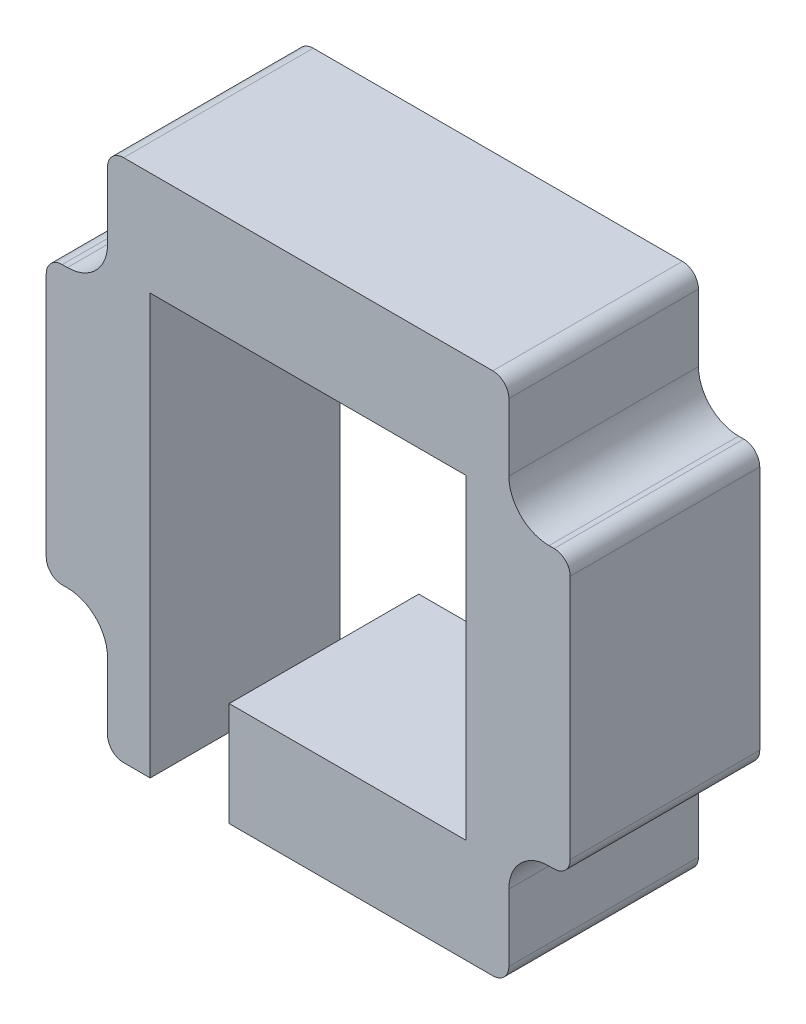
ISO-10303-21;
HEADER;
FILE_DESCRIPTION(('STEP AP214'),'2;1');
FILE_NAME('part.step','',(''),(''),'','','');
FILE_SCHEMA(('AUTOMOTIVE_DESIGN { 1 0 10303 214 1 1 1 1 }'));
ENDSEC;
DATA;
#1=APPLICATION_CONTEXT('core data for automotive mechanical design processes');
#2=APPLICATION_PROTOCOL_DEFINITION('international standard','automotive_design',2000,#1);
#3=PRODUCT_CONTEXT('',#1,'mechanical');
#4=PRODUCT('Part','Part','',(#3));
#5=PRODUCT_RELATED_PRODUCT_CATEGORY('part','',(#4));
#6=PRODUCT_DEFINITION_FORMATION('','',#4);
#7=PRODUCT_DEFINITION_CONTEXT('part definition',#1,'design');
#8=PRODUCT_DEFINITION('design','',#6,#7);
#9=PRODUCT_DEFINITION_SHAPE('','',#8);
#10=(LENGTH_UNIT() NAMED_UNIT(*) SI_UNIT(.MILLI.,.METRE.));
#11=(NAMED_UNIT(*) PLANE_ANGLE_UNIT() SI_UNIT($,.RADIAN.));
#12=(NAMED_UNIT(*) SI_UNIT($,.STERADIAN.) SOLID_ANGLE_UNIT());
#13=UNCERTAINTY_MEASURE_WITH_UNIT(LENGTH_MEASURE(1.E-05),#10,'distance_accuracy_value','');
#14=(GEOMETRIC_REPRESENTATION_CONTEXT(3) GLOBAL_UNCERTAINTY_ASSIGNED_CONTEXT((#13)) GLOBAL_UNIT_ASSIGNED_CONTEXT((#10,
#11,#12)) REPRESENTATION_CONTEXT('',''));
#15=CARTESIAN_POINT('',(0.,0.,0.));
#16=DIRECTION('',(0.,0.,1.));
#17=DIRECTION('',(1.,0.,0.));
#18=AXIS2_PLACEMENT_3D('',#15,#16,#17);
#19=CARTESIAN_POINT('',(29.21,-41.45026,-38.34886));
#20=DIRECTION('',(0.,1.,0.));
#21=DIRECTION('',(0.,0.,1.));
#22=AXIS2_PLACEMENT_3D('',#19,#20,#21);
#23=PLANE('',#22);
#24=DIRECTION('',(1.,0.,0.));
#25=VECTOR('',#24,1.);
#26=CARTESIAN_POINT('',(29.21,-41.45026,-68.34886));
#27=LINE('',#26,#25);
#28=CARTESIAN_POINT('',(-29.21,-41.45026,-68.34886));
#29=VERTEX_POINT('',#28);
#30=CARTESIAN_POINT('',(-25.,-41.45026,-68.34886));
#31=VERTEX_POINT('',#30);
#32=EDGE_CURVE('E240',#29,#31,#27,.T.);
#33=ORIENTED_EDGE('',*,*,#32,.T.);
#34=DIRECTION('',(0.,0.,1.));
#35=VECTOR('',#34,1.);
#36=CARTESIAN_POINT('',(-25.,-41.45026,-73.8896));
#37=LINE('',#36,#35);
#38=CARTESIAN_POINT('',(-25.,-41.45026,-38.34886));
#39=VERTEX_POINT('',#38);
#40=EDGE_CURVE('E250',#31,#39,#37,.T.);
#41=ORIENTED_EDGE('',*,*,#40,.T.);
#42=DIRECTION('',(1.,0.,0.));
#43=VECTOR('',#42,1.);
#44=CARTESIAN_POINT('',(29.21,-41.45026,-38.34886));
#45=LINE('',#44,#43);
#46=CARTESIAN_POINT('',(-29.21,-41.45026,-38.34886));
#47=VERTEX_POINT('',#46);
#48=EDGE_CURVE('E424',#47,#39,#45,.T.);
#49=ORIENTED_EDGE('',*,*,#48,.F.);
#50=DIRECTION('',(0.,0.,-1.));
#51=VECTOR('',#50,1.);
#52=CARTESIAN_POINT('',(-29.21,-41.45026,-38.34886));
#53=LINE('',#52,#51);
#54=EDGE_CURVE('E261',#47,#29,#53,.T.);
#55=ORIENTED_EDGE('',*,*,#54,.T.);
#56=EDGE_LOOP('',(#33,#41,#49,#55));
#57=FACE_BOUND('',#56,.T.);
#58=ADVANCED_FACE('F37',(#57),#23,.F.);
#59=CARTESIAN_POINT('',(-38.91026,-19.41068,-38.34886));
#60=DIRECTION('',(0.,0.,-1.));
#61=DIRECTION('',(-1.,0.,0.));
#62=AXIS2_PLACEMENT_3D('',#59,#60,#61);
#63=CYLINDRICAL_SURFACE('',#62,2.54);
#64=CARTESIAN_POINT('',(-38.91026,-19.41068,-68.34886));
#65=DIRECTION('',(0.,0.,1.));
#66=DIRECTION('',(1.,0.,0.));
#67=AXIS2_PLACEMENT_3D('',#64,#65,#66);
#68=CIRCLE('',#67,2.54);
#69=CARTESIAN_POINT('',(-41.45026,-19.41068,-68.34886));
#70=VERTEX_POINT('',#69);
#71=CARTESIAN_POINT('',(-38.91026,-21.95068,-68.34886));
#72=VERTEX_POINT('',#71);
#73=EDGE_CURVE('E384',#70,#72,#68,.T.);
#74=ORIENTED_EDGE('',*,*,#73,.T.);
#75=DIRECTION('',(0.,0.,-1.));
#76=VECTOR('',#75,1.);
#77=CARTESIAN_POINT('',(-38.91026,-21.95068,-38.34886));
#78=LINE('',#77,#76);
#79=CARTESIAN_POINT('',(-38.91026,-21.95068,-38.34886));
#80=VERTEX_POINT('',#79);
#81=EDGE_CURVE('E11',#80,#72,#78,.T.);
#82=ORIENTED_EDGE('',*,*,#81,.F.);
#83=CARTESIAN_POINT('',(-38.91026,-19.41068,-38.34886));
#84=DIRECTION('',(0.,0.,1.));
#85=DIRECTION('',(1.,0.,0.));
#86=AXIS2_PLACEMENT_3D('',#83,#84,#85);
#87=CIRCLE('',#86,2.54);
#88=CARTESIAN_POINT('',(-41.45026,-19.41068,-38.34886));
#89=VERTEX_POINT('',#88);
#90=EDGE_CURVE('E304',#89,#80,#87,.T.);
#91=ORIENTED_EDGE('',*,*,#90,.F.);
#92=DIRECTION('',(0.,0.,-1.));
#93=VECTOR('',#92,1.);
#94=CARTESIAN_POINT('',(-41.45026,-19.41068,-38.34886));
#95=LINE('',#94,#93);
#96=EDGE_CURVE('E305',#89,#70,#95,.T.);
#97=ORIENTED_EDGE('',*,*,#96,.T.);
#98=EDGE_LOOP('',(#74,#82,#91,#97));
#99=FACE_BOUND('',#98,.T.);
#100=ADVANCED_FACE('F39',(#99),#63,.T.);
#101=CARTESIAN_POINT('',(-38.1,-21.95068,-38.34886));
#102=DIRECTION('',(0.,1.,0.));
#103=DIRECTION('',(0.,0.,1.));
#104=AXIS2_PLACEMENT_3D('',#101,#102,#103);
#105=PLANE('',#104);
#106=DIRECTION('',(1.,0.,0.));
#107=VECTOR('',#106,1.);
#108=CARTESIAN_POINT('',(-38.1,-21.95068,-68.34886));
#109=LINE('',#108,#107);
#110=CARTESIAN_POINT('',(-38.1,-21.95068,-68.34886));
#111=VERTEX_POINT('',#110);
#112=EDGE_CURVE('E381',#72,#111,#109,.T.);
#113=ORIENTED_EDGE('',*,*,#112,.T.);
#114=DIRECTION('',(0.,0.,-1.));
#115=VECTOR('',#114,1.);
#116=CARTESIAN_POINT('',(-38.1,-21.95068,-38.34886));
#117=LINE('',#116,#115);
#118=CARTESIAN_POINT('',(-38.1,-21.95068,-38.34886));
#119=VERTEX_POINT('',#118);
#120=EDGE_CURVE('E45',#119,#111,#117,.T.);
#121=ORIENTED_EDGE('',*,*,#120,.F.);
#122=DIRECTION('',(1.,0.,0.));
#123=VECTOR('',#122,1.);
#124=CARTESIAN_POINT('',(-38.1,-21.95068,-38.34886));
#125=LINE('',#124,#123);
#126=EDGE_CURVE('E432',#80,#119,#125,.T.);
#127=ORIENTED_EDGE('',*,*,#126,.F.);
#128=ORIENTED_EDGE('',*,*,#81,.T.);
#129=EDGE_LOOP('',(#113,#121,#127,#128));
#130=FACE_BOUND('',#129,.T.);
#131=ADVANCED_FACE('F504',(#130),#105,.F.);
#132=CARTESIAN_POINT('',(-38.1,-28.30068,-38.34886));
#133=DIRECTION('',(0.,0.,-1.));
#134=DIRECTION('',(-1.,0.,0.));
#135=AXIS2_PLACEMENT_3D('',#132,#133,#134);
#136=CYLINDRICAL_SURFACE('',#135,6.35);
#137=CARTESIAN_POINT('',(-38.1,-28.30068,-68.34886));
#138=DIRECTION('',(0.,0.,-1.));
#139=DIRECTION('',(1.,0.,0.));
#140=AXIS2_PLACEMENT_3D('',#137,#138,#139);
#141=CIRCLE('',#140,6.35);
#142=CARTESIAN_POINT('',(-31.75,-28.30068,-68.34886));
#143=VERTEX_POINT('',#142);
#144=EDGE_CURVE('E376',#111,#143,#141,.T.);
#145=ORIENTED_EDGE('',*,*,#144,.T.);
#146=DIRECTION('',(0.,0.,-1.));
#147=VECTOR('',#146,1.);
#148=CARTESIAN_POINT('',(-31.75,-28.30068,-38.34886));
#149=LINE('',#148,#147);
#150=CARTESIAN_POINT('',(-31.75,-28.30068,-38.34886));
#151=VERTEX_POINT('',#150);
#152=EDGE_CURVE('E367',#151,#143,#149,.T.);
#153=ORIENTED_EDGE('',*,*,#152,.F.);
#154=CARTESIAN_POINT('',(-38.1,-28.30068,-38.34886));
#155=DIRECTION('',(0.,0.,-1.));
#156=DIRECTION('',(1.,0.,0.));
#157=AXIS2_PLACEMENT_3D('',#154,#155,#156);
#158=CIRCLE('',#157,6.35);
#159=EDGE_CURVE('E377',#119,#151,#158,.T.);
#160=ORIENTED_EDGE('',*,*,#159,.F.);
#161=ORIENTED_EDGE('',*,*,#120,.T.);
#162=EDGE_LOOP('',(#145,#153,#160,#161));
#163=FACE_BOUND('',#162,.T.);
#164=ADVANCED_FACE('F374',(#163),#136,.F.);
#165=CARTESIAN_POINT('',(-31.75,-38.91026,-38.34886));
#166=DIRECTION('',(1.,0.,0.));
#167=DIRECTION('',(0.,1.,0.));
#168=AXIS2_PLACEMENT_3D('',#165,#166,#167);
#169=PLANE('',#168);
#170=DIRECTION('',(0.,-1.,0.));
#171=VECTOR('',#170,1.);
#172=CARTESIAN_POINT('',(-31.75,-38.91026,-68.34886));
#173=LINE('',#172,#171);
#174=CARTESIAN_POINT('',(-31.75,-38.91026,-68.34886));
#175=VERTEX_POINT('',#174);
#176=EDGE_CURVE('E382',#143,#175,#173,.T.);
#177=ORIENTED_EDGE('',*,*,#176,.T.);
#178=DIRECTION('',(0.,0.,-1.));
#179=VECTOR('',#178,1.);
#180=CARTESIAN_POINT('',(-31.75,-38.91026,-38.34886));
#181=LINE('',#180,#179);
#182=CARTESIAN_POINT('',(-31.75,-38.91026,-38.34886));
#183=VERTEX_POINT('',#182);
#184=EDGE_CURVE('E364',#183,#175,#181,.T.);
#185=ORIENTED_EDGE('',*,*,#184,.F.);
#186=DIRECTION('',(0.,-1.,0.));
#187=VECTOR('',#186,1.);
#188=CARTESIAN_POINT('',(-31.75,-38.91026,-38.34886));
#189=LINE('',#188,#187);
#190=EDGE_CURVE('E429',#151,#183,#189,.T.);
#191=ORIENTED_EDGE('',*,*,#190,.F.);
#192=ORIENTED_EDGE('',*,*,#152,.T.);
#193=EDGE_LOOP('',(#177,#185,#191,#192));
#194=FACE_BOUND('',#193,.T.);
#195=ADVANCED_FACE('F496',(#194),#169,.F.);
#196=CARTESIAN_POINT('',(-29.21,-38.91026,-38.34886));
#197=DIRECTION('',(0.,0.,-1.));
#198=DIRECTION('',(-1.,0.,0.));
#199=AXIS2_PLACEMENT_3D('',#196,#197,#198);
#200=CYLINDRICAL_SURFACE('',#199,2.54);
#201=CARTESIAN_POINT('',(-29.21,-38.91026,-68.34886));
#202=DIRECTION('',(0.,0.,1.));
#203=DIRECTION('',(1.,0.,0.));
#204=AXIS2_PLACEMENT_3D('',#201,#202,#203);
#205=CIRCLE('',#204,2.54);
#206=EDGE_CURVE('E267',#175,#29,#205,.T.);
#207=ORIENTED_EDGE('',*,*,#206,.T.);
#208=ORIENTED_EDGE('',*,*,#54,.F.);
#209=CARTESIAN_POINT('',(-29.21,-38.91026,-38.34886));
#210=DIRECTION('',(0.,0.,1.));
#211=DIRECTION('',(1.,0.,0.));
#212=AXIS2_PLACEMENT_3D('',#209,#210,#211);
#213=CIRCLE('',#212,2.54);
#214=EDGE_CURVE('E427',#183,#47,#213,.T.);
#215=ORIENTED_EDGE('',*,*,#214,.F.);
#216=ORIENTED_EDGE('',*,*,#184,.T.);
#217=EDGE_LOOP('',(#207,#208,#215,#216));
#218=FACE_BOUND('',#217,.T.);
#219=ADVANCED_FACE('F494',(#218),#200,.T.);
#220=CARTESIAN_POINT('',(-12.5,-41.45026,-38.34886));
#221=VERTEX_POINT('',#220);
#222=CARTESIAN_POINT('',(29.21,-41.45026,-38.34886));
#223=VERTEX_POINT('',#222);
#224=EDGE_CURVE('E426',#221,#223,#45,.T.);
#225=ORIENTED_EDGE('',*,*,#224,.F.);
#226=DIRECTION('',(0.,0.,1.));
#227=VECTOR('',#226,1.);
#228=CARTESIAN_POINT('',(-12.5,-41.45026,-73.8896));
#229=LINE('',#228,#227);
#230=CARTESIAN_POINT('',(-12.5,-41.45026,-68.34886));
#231=VERTEX_POINT('',#230);
#232=EDGE_CURVE('E257',#231,#221,#229,.T.);
#233=ORIENTED_EDGE('',*,*,#232,.F.);
#234=CARTESIAN_POINT('',(29.21,-41.45026,-68.34886));
#235=VERTEX_POINT('',#234);
#236=EDGE_CURVE('E263',#231,#235,#27,.T.);
#237=ORIENTED_EDGE('',*,*,#236,.T.);
#238=DIRECTION('',(0.,0.,-1.));
#239=VECTOR('',#238,1.);
#240=CARTESIAN_POINT('',(29.21,-41.45026,-38.34886));
#241=LINE('',#240,#239);
#242=EDGE_CURVE('E360',#223,#235,#241,.T.);
#243=ORIENTED_EDGE('',*,*,#242,.F.);
#244=EDGE_LOOP('',(#225,#233,#237,#243));
#245=FACE_BOUND('',#244,.T.);
#246=ADVANCED_FACE('F466',(#245),#23,.F.);
#247=CARTESIAN_POINT('',(29.21,-38.91026,-38.34886));
#248=DIRECTION('',(0.,0.,-1.));
#249=DIRECTION('',(-1.,0.,0.));
#250=AXIS2_PLACEMENT_3D('',#247,#248,#249);
#251=CYLINDRICAL_SURFACE('',#250,2.54);
#252=CARTESIAN_POINT('',(29.21,-38.91026,-68.34886));
#253=DIRECTION('',(0.,0.,1.));
#254=DIRECTION('',(1.,0.,0.));
#255=AXIS2_PLACEMENT_3D('',#252,#253,#254);
#256=CIRCLE('',#255,2.54);
#257=CARTESIAN_POINT('',(31.75,-38.91026,-68.34886));
#258=VERTEX_POINT('',#257);
#259=EDGE_CURVE('E262',#235,#258,#256,.T.);
#260=ORIENTED_EDGE('',*,*,#259,.T.);
#261=DIRECTION('',(0.,0.,-1.));
#262=VECTOR('',#261,1.);
#263=CARTESIAN_POINT('',(31.75,-38.91026,-38.34886));
#264=LINE('',#263,#262);
#265=CARTESIAN_POINT('',(31.75,-38.91026,-38.34886));
#266=VERTEX_POINT('',#265);
#267=EDGE_CURVE('E357',#266,#258,#264,.T.);
#268=ORIENTED_EDGE('',*,*,#267,.F.);
#269=CARTESIAN_POINT('',(29.21,-38.91026,-38.34886));
#270=DIRECTION('',(0.,0.,1.));
#271=DIRECTION('',(1.,0.,0.));
#272=AXIS2_PLACEMENT_3D('',#269,#270,#271);
#273=CIRCLE('',#272,2.54);
#274=EDGE_CURVE('E422',#223,#266,#273,.T.);
#275=ORIENTED_EDGE('',*,*,#274,.F.);
#276=ORIENTED_EDGE('',*,*,#242,.T.);
#277=EDGE_LOOP('',(#260,#268,#275,#276));
#278=FACE_BOUND('',#277,.T.);
#279=ADVANCED_FACE('F473',(#278),#251,.T.);
#280=CARTESIAN_POINT('',(31.75,-28.30068,-38.34886));
#281=DIRECTION('',(-1.,0.,0.));
#282=DIRECTION('',(0.,-1.,0.));
#283=AXIS2_PLACEMENT_3D('',#280,#281,#282);
#284=PLANE('',#283);
#285=DIRECTION('',(0.,1.,0.));
#286=VECTOR('',#285,1.);
#287=CARTESIAN_POINT('',(31.75,-28.30068,-68.34886));
#288=LINE('',#287,#286);
#289=CARTESIAN_POINT('',(31.75,-28.30068,-68.34886));
#290=VERTEX_POINT('',#289);
#291=EDGE_CURVE('E265',#258,#290,#288,.T.);
#292=ORIENTED_EDGE('',*,*,#291,.T.);
#293=DIRECTION('',(0.,0.,-1.));
#294=VECTOR('',#293,1.);
#295=CARTESIAN_POINT('',(31.75,-28.30068,-38.34886));
#296=LINE('',#295,#294);
#297=CARTESIAN_POINT('',(31.75,-28.30068,-38.34886));
#298=VERTEX_POINT('',#297);
#299=EDGE_CURVE('E354',#298,#290,#296,.T.);
#300=ORIENTED_EDGE('',*,*,#299,.F.);
#301=DIRECTION('',(0.,1.,0.));
#302=VECTOR('',#301,1.);
#303=CARTESIAN_POINT('',(31.75,-28.30068,-38.34886));
#304=LINE('',#303,#302);
#305=EDGE_CURVE('E420',#266,#298,#304,.T.);
#306=ORIENTED_EDGE('',*,*,#305,.F.);
#307=ORIENTED_EDGE('',*,*,#267,.T.);
#308=EDGE_LOOP('',(#292,#300,#306,#307));
#309=FACE_BOUND('',#308,.T.);
#310=ADVANCED_FACE('F477',(#309),#284,.F.);
#311=CARTESIAN_POINT('',(38.1,-28.30068,-38.34886));
#312=DIRECTION('',(0.,0.,-1.));
#313=DIRECTION('',(-1.,0.,0.));
#314=AXIS2_PLACEMENT_3D('',#311,#312,#313);
#315=CYLINDRICAL_SURFACE('',#314,6.35);
#316=CARTESIAN_POINT('',(38.1,-28.30068,-68.34886));
#317=DIRECTION('',(0.,0.,-1.));
#318=DIRECTION('',(1.,0.,0.));
#319=AXIS2_PLACEMENT_3D('',#316,#317,#318);
#320=CIRCLE('',#319,6.35);
#321=CARTESIAN_POINT('',(38.1,-21.95068,-68.34886));
#322=VERTEX_POINT('',#321);
#323=EDGE_CURVE('E272',#290,#322,#320,.T.);
#324=ORIENTED_EDGE('',*,*,#323,.T.);
#325=DIRECTION('',(0.,0.,-1.));
#326=VECTOR('',#325,1.);
#327=CARTESIAN_POINT('',(38.1,-21.95068,-38.34886));
#328=LINE('',#327,#326);
#329=CARTESIAN_POINT('',(38.1,-21.95068,-38.34886));
#330=VERTEX_POINT('',#329);
#331=EDGE_CURVE('E351',#330,#322,#328,.T.);
#332=ORIENTED_EDGE('',*,*,#331,.F.);
#333=CARTESIAN_POINT('',(38.1,-28.30068,-38.34886));
#334=DIRECTION('',(0.,0.,-1.));
#335=DIRECTION('',(1.,0.,0.));
#336=AXIS2_PLACEMENT_3D('',#333,#334,#335);
#337=CIRCLE('',#336,6.35);
#338=EDGE_CURVE('E418',#298,#330,#337,.T.);
#339=ORIENTED_EDGE('',*,*,#338,.F.);
#340=ORIENTED_EDGE('',*,*,#299,.T.);
#341=EDGE_LOOP('',(#324,#332,#339,#340));
#342=FACE_BOUND('',#341,.T.);
#343=ADVANCED_FACE('F520',(#342),#315,.F.);
#344=CARTESIAN_POINT('',(38.1,-21.95068,-38.34886));
#345=DIRECTION('',(0.,1.,0.));
#346=DIRECTION('',(0.,0.,1.));
#347=AXIS2_PLACEMENT_3D('',#344,#345,#346);
#348=PLANE('',#347);
#349=DIRECTION('',(1.,0.,0.));
#350=VECTOR('',#349,1.);
#351=CARTESIAN_POINT('',(38.1,-21.95068,-68.34886));
#352=LINE('',#351,#350);
#353=CARTESIAN_POINT('',(38.91026,-21.95068,-68.34886));
#354=VERTEX_POINT('',#353);
#355=EDGE_CURVE('E274',#322,#354,#352,.T.);
#356=ORIENTED_EDGE('',*,*,#355,.T.);
#357=DIRECTION('',(0.,0.,-1.));
#358=VECTOR('',#357,1.);
#359=CARTESIAN_POINT('',(38.91026,-21.95068,-38.34886));
#360=LINE('',#359,#358);
#361=CARTESIAN_POINT('',(38.91026,-21.95068,-38.34886));
#362=VERTEX_POINT('',#361);
#363=EDGE_CURVE('E348',#362,#354,#360,.T.);
#364=ORIENTED_EDGE('',*,*,#363,.F.);
#365=DIRECTION('',(1.,0.,0.));
#366=VECTOR('',#365,1.);
#367=CARTESIAN_POINT('',(38.1,-21.95068,-38.34886));
#368=LINE('',#367,#366);
#369=EDGE_CURVE('E416',#330,#362,#368,.T.);
#370=ORIENTED_EDGE('',*,*,#369,.F.);
#371=ORIENTED_EDGE('',*,*,#331,.T.);
#372=EDGE_LOOP('',(#356,#364,#370,#371));
#373=FACE_BOUND('',#372,.T.);
#374=ADVANCED_FACE('F525',(#373),#348,.F.);
#375=CARTESIAN_POINT('',(38.91026,-19.41068,-38.34886));
#376=DIRECTION('',(0.,0.,-1.));
#377=DIRECTION('',(-1.,0.,0.));
#378=AXIS2_PLACEMENT_3D('',#375,#376,#377);
#379=CYLINDRICAL_SURFACE('',#378,2.54);
#380=CARTESIAN_POINT('',(38.91026,-19.41068,-68.34886));
#381=DIRECTION('',(0.,0.,1.));
#382=DIRECTION('',(1.,0.,0.));
#383=AXIS2_PLACEMENT_3D('',#380,#381,#382);
#384=CIRCLE('',#383,2.54);
#385=CARTESIAN_POINT('',(41.45026,-19.41068,-68.34886));
#386=VERTEX_POINT('',#385);
#387=EDGE_CURVE('E276',#354,#386,#384,.T.);
#388=ORIENTED_EDGE('',*,*,#387,.T.);
#389=DIRECTION('',(0.,0.,-1.));
#390=VECTOR('',#389,1.);
#391=CARTESIAN_POINT('',(41.45026,-19.41068,-38.34886));
#392=LINE('',#391,#390);
#393=CARTESIAN_POINT('',(41.45026,-19.41068,-38.34886));
#394=VERTEX_POINT('',#393);
#395=EDGE_CURVE('E345',#394,#386,#392,.T.);
#396=ORIENTED_EDGE('',*,*,#395,.F.);
#397=CARTESIAN_POINT('',(38.91026,-19.41068,-38.34886));
#398=DIRECTION('',(0.,0.,1.));
#399=DIRECTION('',(1.,0.,0.));
#400=AXIS2_PLACEMENT_3D('',#397,#398,#399);
#401=CIRCLE('',#400,2.54);
#402=EDGE_CURVE('E414',#362,#394,#401,.T.);
#403=ORIENTED_EDGE('',*,*,#402,.F.);
#404=ORIENTED_EDGE('',*,*,#363,.T.);
#405=EDGE_LOOP('',(#388,#396,#403,#404));
#406=FACE_BOUND('',#405,.T.);
#407=ADVANCED_FACE('F529',(#406),#379,.T.);
#408=CARTESIAN_POINT('',(41.45026,19.41068,-38.34886));
#409=DIRECTION('',(-1.,0.,0.));
#410=DIRECTION('',(0.,0.,1.));
#411=AXIS2_PLACEMENT_3D('',#408,#409,#410);
#412=PLANE('',#411);
#413=DIRECTION('',(0.,1.,0.));
#414=VECTOR('',#413,1.);
#415=CARTESIAN_POINT('',(41.45026,19.41068,-68.34886));
#416=LINE('',#415,#414);
#417=CARTESIAN_POINT('',(41.45026,19.41068,-68.34886));
#418=VERTEX_POINT('',#417);
#419=EDGE_CURVE('E278',#386,#418,#416,.T.);
#420=ORIENTED_EDGE('',*,*,#419,.T.);
#421=DIRECTION('',(0.,0.,-1.));
#422=VECTOR('',#421,1.);
#423=CARTESIAN_POINT('',(41.45026,19.41068,-38.34886));
#424=LINE('',#423,#422);
#425=CARTESIAN_POINT('',(41.45026,19.41068,-38.34886));
#426=VERTEX_POINT('',#425);
#427=EDGE_CURVE('E342',#426,#418,#424,.T.);
#428=ORIENTED_EDGE('',*,*,#427,.F.);
#429=DIRECTION('',(0.,1.,0.));
#430=VECTOR('',#429,1.);
#431=CARTESIAN_POINT('',(41.45026,19.41068,-38.34886));
#432=LINE('',#431,#430);
#433=EDGE_CURVE('E412',#394,#426,#432,.T.);
#434=ORIENTED_EDGE('',*,*,#433,.F.);
#435=ORIENTED_EDGE('',*,*,#395,.T.);
#436=EDGE_LOOP('',(#420,#428,#434,#435));
#437=FACE_BOUND('',#436,.T.);
#438=ADVANCED_FACE('F533',(#437),#412,.F.);
#439=CARTESIAN_POINT('',(38.91026,19.41068,-38.34886));
#440=DIRECTION('',(0.,0.,-1.));
#441=DIRECTION('',(-1.,0.,0.));
#442=AXIS2_PLACEMENT_3D('',#439,#440,#441);
#443=CYLINDRICAL_SURFACE('',#442,2.54);
#444=CARTESIAN_POINT('',(38.91026,19.41068,-68.34886));
#445=DIRECTION('',(0.,0.,1.));
#446=DIRECTION('',(1.,0.,0.));
#447=AXIS2_PLACEMENT_3D('',#444,#445,#446);
#448=CIRCLE('',#447,2.54);
#449=CARTESIAN_POINT('',(38.91026,21.95068,-68.34886));
#450=VERTEX_POINT('',#449);
#451=EDGE_CURVE('E280',#418,#450,#448,.T.);
#452=ORIENTED_EDGE('',*,*,#451,.T.);
#453=DIRECTION('',(0.,0.,-1.));
#454=VECTOR('',#453,1.);
#455=CARTESIAN_POINT('',(38.91026,21.95068,-38.34886));
#456=LINE('',#455,#454);
#457=CARTESIAN_POINT('',(38.91026,21.95068,-38.34886));
#458=VERTEX_POINT('',#457);
#459=EDGE_CURVE('E339',#458,#450,#456,.T.);
#460=ORIENTED_EDGE('',*,*,#459,.F.);
#461=CARTESIAN_POINT('',(38.91026,19.41068,-38.34886));
#462=DIRECTION('',(0.,0.,1.));
#463=DIRECTION('',(1.,0.,0.));
#464=AXIS2_PLACEMENT_3D('',#461,#462,#463);
#465=CIRCLE('',#464,2.54);
#466=EDGE_CURVE('E410',#426,#458,#465,.T.);
#467=ORIENTED_EDGE('',*,*,#466,.F.);
#468=ORIENTED_EDGE('',*,*,#427,.T.);
#469=EDGE_LOOP('',(#452,#460,#467,#468));
#470=FACE_BOUND('',#469,.T.);
#471=ADVANCED_FACE('F537',(#470),#443,.T.);
#472=CARTESIAN_POINT('',(38.91026,21.95068,-38.34886));
#473=DIRECTION('',(0.,-1.,0.));
#474=DIRECTION('',(0.,0.,-1.));
#475=AXIS2_PLACEMENT_3D('',#472,#473,#474);
#476=PLANE('',#475);
#477=DIRECTION('',(-1.,0.,0.));
#478=VECTOR('',#477,1.);
#479=CARTESIAN_POINT('',(38.91026,21.95068,-68.34886));
#480=LINE('',#479,#478);
#481=CARTESIAN_POINT('',(38.1,21.95068,-68.34886));
#482=VERTEX_POINT('',#481);
#483=EDGE_CURVE('E282',#450,#482,#480,.T.);
#484=ORIENTED_EDGE('',*,*,#483,.T.);
#485=DIRECTION('',(0.,0.,-1.));
#486=VECTOR('',#485,1.);
#487=CARTESIAN_POINT('',(38.1,21.95068,-38.34886));
#488=LINE('',#487,#486);
#489=CARTESIAN_POINT('',(38.1,21.95068,-38.34886));
#490=VERTEX_POINT('',#489);
#491=EDGE_CURVE('E336',#490,#482,#488,.T.);
#492=ORIENTED_EDGE('',*,*,#491,.F.);
#493=DIRECTION('',(-1.,0.,0.));
#494=VECTOR('',#493,1.);
#495=CARTESIAN_POINT('',(38.91026,21.95068,-38.34886));
#496=LINE('',#495,#494);
#497=EDGE_CURVE('E408',#458,#490,#496,.T.);
#498=ORIENTED_EDGE('',*,*,#497,.F.);
#499=ORIENTED_EDGE('',*,*,#459,.T.);
#500=EDGE_LOOP('',(#484,#492,#498,#499));
#501=FACE_BOUND('',#500,.T.);
#502=ADVANCED_FACE('F541',(#501),#476,.F.);
#503=CARTESIAN_POINT('',(38.1,28.30068,-38.34886));
#504=DIRECTION('',(0.,0.,-1.));
#505=DIRECTION('',(-1.,0.,0.));
#506=AXIS2_PLACEMENT_3D('',#503,#504,#505);
#507=CYLINDRICAL_SURFACE('',#506,6.35);
#508=CARTESIAN_POINT('',(38.1,28.30068,-68.34886));
#509=DIRECTION('',(0.,0.,-1.));
#510=DIRECTION('',(1.,0.,0.));
#511=AXIS2_PLACEMENT_3D('',#508,#509,#510);
#512=CIRCLE('',#511,6.35);
#513=CARTESIAN_POINT('',(31.75,28.30068,-68.34886));
#514=VERTEX_POINT('',#513);
#515=EDGE_CURVE('E284',#482,#514,#512,.T.);
#516=ORIENTED_EDGE('',*,*,#515,.T.);
#517=DIRECTION('',(0.,0.,-1.));
#518=VECTOR('',#517,1.);
#519=CARTESIAN_POINT('',(31.75,28.30068,-38.34886));
#520=LINE('',#519,#518);
#521=CARTESIAN_POINT('',(31.75,28.30068,-38.34886));
#522=VERTEX_POINT('',#521);
#523=EDGE_CURVE('E333',#522,#514,#520,.T.);
#524=ORIENTED_EDGE('',*,*,#523,.F.);
#525=CARTESIAN_POINT('',(38.1,28.30068,-38.34886));
#526=DIRECTION('',(0.,0.,-1.));
#527=DIRECTION('',(1.,0.,0.));
#528=AXIS2_PLACEMENT_3D('',#525,#526,#527);
#529=CIRCLE('',#528,6.35);
#530=EDGE_CURVE('E406',#490,#522,#529,.T.);
#531=ORIENTED_EDGE('',*,*,#530,.F.);
#532=ORIENTED_EDGE('',*,*,#491,.T.);
#533=EDGE_LOOP('',(#516,#524,#531,#532));
#534=FACE_BOUND('',#533,.T.);
#535=ADVANCED_FACE('F545',(#534),#507,.F.);
#536=CARTESIAN_POINT('',(31.75,38.91026,-38.34886));
#537=DIRECTION('',(-1.,0.,0.));
#538=DIRECTION('',(0.,-1.,0.));
#539=AXIS2_PLACEMENT_3D('',#536,#537,#538);
#540=PLANE('',#539);
#541=DIRECTION('',(0.,1.,0.));
#542=VECTOR('',#541,1.);
#543=CARTESIAN_POINT('',(31.75,38.91026,-68.34886));
#544=LINE('',#543,#542);
#545=CARTESIAN_POINT('',(31.75,38.91026,-68.34886));
#546=VERTEX_POINT('',#545);
#547=EDGE_CURVE('E286',#514,#546,#544,.T.);
#548=ORIENTED_EDGE('',*,*,#547,.T.);
#549=DIRECTION('',(0.,0.,-1.));
#550=VECTOR('',#549,1.);
#551=CARTESIAN_POINT('',(31.75,38.91026,-38.34886));
#552=LINE('',#551,#550);
#553=CARTESIAN_POINT('',(31.75,38.91026,-38.34886));
#554=VERTEX_POINT('',#553);
#555=EDGE_CURVE('E330',#554,#546,#552,.T.);
#556=ORIENTED_EDGE('',*,*,#555,.F.);
#557=DIRECTION('',(0.,1.,0.));
#558=VECTOR('',#557,1.);
#559=CARTESIAN_POINT('',(31.75,38.91026,-38.34886));
#560=LINE('',#559,#558);
#561=EDGE_CURVE('E404',#522,#554,#560,.T.);
#562=ORIENTED_EDGE('',*,*,#561,.F.);
#563=ORIENTED_EDGE('',*,*,#523,.T.);
#564=EDGE_LOOP('',(#548,#556,#562,#563));
#565=FACE_BOUND('',#564,.T.);
#566=ADVANCED_FACE('F549',(#565),#540,.F.);
#567=CARTESIAN_POINT('',(29.21,38.91026,-38.34886));
#568=DIRECTION('',(0.,0.,-1.));
#569=DIRECTION('',(-1.,0.,0.));
#570=AXIS2_PLACEMENT_3D('',#567,#568,#569);
#571=CYLINDRICAL_SURFACE('',#570,2.54);
#572=CARTESIAN_POINT('',(29.21,38.91026,-68.34886));
#573=DIRECTION('',(0.,0.,1.));
#574=DIRECTION('',(1.,0.,0.));
#575=AXIS2_PLACEMENT_3D('',#572,#573,#574);
#576=CIRCLE('',#575,2.54);
#577=CARTESIAN_POINT('',(29.21,41.45026,-68.34886));
#578=VERTEX_POINT('',#577);
#579=EDGE_CURVE('E288',#546,#578,#576,.T.);
#580=ORIENTED_EDGE('',*,*,#579,.T.);
#581=DIRECTION('',(0.,0.,-1.));
#582=VECTOR('',#581,1.);
#583=CARTESIAN_POINT('',(29.21,41.45026,-38.34886));
#584=LINE('',#583,#582);
#585=CARTESIAN_POINT('',(29.21,41.45026,-38.34886));
#586=VERTEX_POINT('',#585);
#587=EDGE_CURVE('E327',#586,#578,#584,.T.);
#588=ORIENTED_EDGE('',*,*,#587,.F.);
#589=CARTESIAN_POINT('',(29.21,38.91026,-38.34886));
#590=DIRECTION('',(0.,0.,1.));
#591=DIRECTION('',(1.,0.,0.));
#592=AXIS2_PLACEMENT_3D('',#589,#590,#591);
#593=CIRCLE('',#592,2.54);
#594=EDGE_CURVE('E402',#554,#586,#593,.T.);
#595=ORIENTED_EDGE('',*,*,#594,.F.);
#596=ORIENTED_EDGE('',*,*,#555,.T.);
#597=EDGE_LOOP('',(#580,#588,#595,#596));
#598=FACE_BOUND('',#597,.T.);
#599=ADVANCED_FACE('F553',(#598),#571,.T.);
#600=CARTESIAN_POINT('',(-29.21,41.45026,-38.34886));
#601=DIRECTION('',(0.,-1.,0.));
#602=DIRECTION('',(0.,0.,-1.));
#603=AXIS2_PLACEMENT_3D('',#600,#601,#602);
#604=PLANE('',#603);
#605=DIRECTION('',(-1.,0.,0.));
#606=VECTOR('',#605,1.);
#607=CARTESIAN_POINT('',(-29.21,41.45026,-68.34886));
#608=LINE('',#607,#606);
#609=CARTESIAN_POINT('',(-29.21,41.45026,-68.34886));
#610=VERTEX_POINT('',#609);
#611=EDGE_CURVE('E290',#578,#610,#608,.T.);
#612=ORIENTED_EDGE('',*,*,#611,.T.);
#613=DIRECTION('',(0.,0.,-1.));
#614=VECTOR('',#613,1.);
#615=CARTESIAN_POINT('',(-29.21,41.45026,-38.34886));
#616=LINE('',#615,#614);
#617=CARTESIAN_POINT('',(-29.21,41.45026,-38.34886));
#618=VERTEX_POINT('',#617);
#619=EDGE_CURVE('E324',#618,#610,#616,.T.);
#620=ORIENTED_EDGE('',*,*,#619,.F.);
#621=DIRECTION('',(-1.,0.,0.));
#622=VECTOR('',#621,1.);
#623=CARTESIAN_POINT('',(-29.21,41.45026,-38.34886));
#624=LINE('',#623,#622);
#625=EDGE_CURVE('E400',#586,#618,#624,.T.);
#626=ORIENTED_EDGE('',*,*,#625,.F.);
#627=ORIENTED_EDGE('',*,*,#587,.T.);
#628=EDGE_LOOP('',(#612,#620,#626,#627));
#629=FACE_BOUND('',#628,.T.);
#630=ADVANCED_FACE('F557',(#629),#604,.F.);
#631=CARTESIAN_POINT('',(-29.21,38.91026,-38.34886));
#632=DIRECTION('',(0.,0.,-1.));
#633=DIRECTION('',(-1.,0.,0.));
#634=AXIS2_PLACEMENT_3D('',#631,#632,#633);
#635=CYLINDRICAL_SURFACE('',#634,2.54);
#636=CARTESIAN_POINT('',(-29.21,38.91026,-68.34886));
#637=DIRECTION('',(0.,0.,1.));
#638=DIRECTION('',(1.,0.,0.));
#639=AXIS2_PLACEMENT_3D('',#636,#637,#638);
#640=CIRCLE('',#639,2.54);
#641=CARTESIAN_POINT('',(-31.75,38.91026,-68.34886));
#642=VERTEX_POINT('',#641);
#643=EDGE_CURVE('E292',#610,#642,#640,.T.);
#644=ORIENTED_EDGE('',*,*,#643,.T.);
#645=DIRECTION('',(0.,0.,-1.));
#646=VECTOR('',#645,1.);
#647=CARTESIAN_POINT('',(-31.75,38.91026,-38.34886));
#648=LINE('',#647,#646);
#649=CARTESIAN_POINT('',(-31.75,38.91026,-38.34886));
#650=VERTEX_POINT('',#649);
#651=EDGE_CURVE('E321',#650,#642,#648,.T.);
#652=ORIENTED_EDGE('',*,*,#651,.F.);
#653=CARTESIAN_POINT('',(-29.21,38.91026,-38.34886));
#654=DIRECTION('',(0.,0.,1.));
#655=DIRECTION('',(1.,0.,0.));
#656=AXIS2_PLACEMENT_3D('',#653,#654,#655);
#657=CIRCLE('',#656,2.54);
#658=EDGE_CURVE('E398',#618,#650,#657,.T.);
#659=ORIENTED_EDGE('',*,*,#658,.F.);
#660=ORIENTED_EDGE('',*,*,#619,.T.);
#661=EDGE_LOOP('',(#644,#652,#659,#660));
#662=FACE_BOUND('',#661,.T.);
#663=ADVANCED_FACE('F561',(#662),#635,.T.);
#664=CARTESIAN_POINT('',(-31.75,28.30068,-38.34886));
#665=DIRECTION('',(1.,0.,0.));
#666=DIRECTION('',(0.,1.,0.));
#667=AXIS2_PLACEMENT_3D('',#664,#665,#666);
#668=PLANE('',#667);
#669=DIRECTION('',(0.,-1.,0.));
#670=VECTOR('',#669,1.);
#671=CARTESIAN_POINT('',(-31.75,28.30068,-68.34886));
#672=LINE('',#671,#670);
#673=CARTESIAN_POINT('',(-31.75,28.30068,-68.34886));
#674=VERTEX_POINT('',#673);
#675=EDGE_CURVE('E294',#642,#674,#672,.T.);
#676=ORIENTED_EDGE('',*,*,#675,.T.);
#677=DIRECTION('',(0.,0.,-1.));
#678=VECTOR('',#677,1.);
#679=CARTESIAN_POINT('',(-31.75,28.30068,-38.34886));
#680=LINE('',#679,#678);
#681=CARTESIAN_POINT('',(-31.75,28.30068,-38.34886));
#682=VERTEX_POINT('',#681);
#683=EDGE_CURVE('E318',#682,#674,#680,.T.);
#684=ORIENTED_EDGE('',*,*,#683,.F.);
#685=DIRECTION('',(0.,-1.,0.));
#686=VECTOR('',#685,1.);
#687=CARTESIAN_POINT('',(-31.75,28.30068,-38.34886));
#688=LINE('',#687,#686);
#689=EDGE_CURVE('E396',#650,#682,#688,.T.);
#690=ORIENTED_EDGE('',*,*,#689,.F.);
#691=ORIENTED_EDGE('',*,*,#651,.T.);
#692=EDGE_LOOP('',(#676,#684,#690,#691));
#693=FACE_BOUND('',#692,.T.);
#694=ADVANCED_FACE('F565',(#693),#668,.F.);
#695=CARTESIAN_POINT('',(-38.1,28.30068,-38.34886));
#696=DIRECTION('',(0.,0.,-1.));
#697=DIRECTION('',(-1.,0.,0.));
#698=AXIS2_PLACEMENT_3D('',#695,#696,#697);
#699=CYLINDRICAL_SURFACE('',#698,6.35);
#700=CARTESIAN_POINT('',(-38.1,28.30068,-68.34886));
#701=DIRECTION('',(0.,0.,-1.));
#702=DIRECTION('',(1.,0.,0.));
#703=AXIS2_PLACEMENT_3D('',#700,#701,#702);
#704=CIRCLE('',#703,6.35);
#705=CARTESIAN_POINT('',(-38.1,21.95068,-68.34886));
#706=VERTEX_POINT('',#705);
#707=EDGE_CURVE('E296',#674,#706,#704,.T.);
#708=ORIENTED_EDGE('',*,*,#707,.T.);
#709=DIRECTION('',(0.,0.,-1.));
#710=VECTOR('',#709,1.);
#711=CARTESIAN_POINT('',(-38.1,21.95068,-38.34886));
#712=LINE('',#711,#710);
#713=CARTESIAN_POINT('',(-38.1,21.95068,-38.34886));
#714=VERTEX_POINT('',#713);
#715=EDGE_CURVE('E315',#714,#706,#712,.T.);
#716=ORIENTED_EDGE('',*,*,#715,.F.);
#717=CARTESIAN_POINT('',(-38.1,28.30068,-38.34886));
#718=DIRECTION('',(0.,0.,-1.));
#719=DIRECTION('',(1.,0.,0.));
#720=AXIS2_PLACEMENT_3D('',#717,#718,#719);
#721=CIRCLE('',#720,6.35);
#722=EDGE_CURVE('E394',#682,#714,#721,.T.);
#723=ORIENTED_EDGE('',*,*,#722,.F.);
#724=ORIENTED_EDGE('',*,*,#683,.T.);
#725=EDGE_LOOP('',(#708,#716,#723,#724));
#726=FACE_BOUND('',#725,.T.);
#727=ADVANCED_FACE('F569',(#726),#699,.F.);
#728=CARTESIAN_POINT('',(-38.1,21.95068,-38.34886));
#729=DIRECTION('',(0.,-1.,0.));
#730=DIRECTION('',(0.,0.,-1.));
#731=AXIS2_PLACEMENT_3D('',#728,#729,#730);
#732=PLANE('',#731);
#733=DIRECTION('',(-1.,0.,0.));
#734=VECTOR('',#733,1.);
#735=CARTESIAN_POINT('',(-38.1,21.95068,-68.34886));
#736=LINE('',#735,#734);
#737=CARTESIAN_POINT('',(-38.91026,21.95068,-68.34886));
#738=VERTEX_POINT('',#737);
#739=EDGE_CURVE('E298',#706,#738,#736,.T.);
#740=ORIENTED_EDGE('',*,*,#739,.T.);
#741=DIRECTION('',(0.,0.,-1.));
#742=VECTOR('',#741,1.);
#743=CARTESIAN_POINT('',(-38.91026,21.95068,-38.34886));
#744=LINE('',#743,#742);
#745=CARTESIAN_POINT('',(-38.91026,21.95068,-38.34886));
#746=VERTEX_POINT('',#745);
#747=EDGE_CURVE('E312',#746,#738,#744,.T.);
#748=ORIENTED_EDGE('',*,*,#747,.F.);
#749=DIRECTION('',(-1.,0.,0.));
#750=VECTOR('',#749,1.);
#751=CARTESIAN_POINT('',(-38.1,21.95068,-38.34886));
#752=LINE('',#751,#750);
#753=EDGE_CURVE('E392',#714,#746,#752,.T.);
#754=ORIENTED_EDGE('',*,*,#753,.F.);
#755=ORIENTED_EDGE('',*,*,#715,.T.);
#756=EDGE_LOOP('',(#740,#748,#754,#755));
#757=FACE_BOUND('',#756,.T.);
#758=ADVANCED_FACE('F573',(#757),#732,.F.);
#759=CARTESIAN_POINT('',(-38.91026,19.41068,-38.34886));
#760=DIRECTION('',(0.,0.,-1.));
#761=DIRECTION('',(-1.,0.,0.));
#762=AXIS2_PLACEMENT_3D('',#759,#760,#761);
#763=CYLINDRICAL_SURFACE('',#762,2.54);
#764=CARTESIAN_POINT('',(-38.91026,19.41068,-68.34886));
#765=DIRECTION('',(0.,0.,1.));
#766=DIRECTION('',(1.,0.,0.));
#767=AXIS2_PLACEMENT_3D('',#764,#765,#766);
#768=CIRCLE('',#767,2.54);
#769=CARTESIAN_POINT('',(-41.45026,19.41068,-68.34886));
#770=VERTEX_POINT('',#769);
#771=EDGE_CURVE('E300',#738,#770,#768,.T.);
#772=ORIENTED_EDGE('',*,*,#771,.T.);
#773=DIRECTION('',(0.,0.,-1.));
#774=VECTOR('',#773,1.);
#775=CARTESIAN_POINT('',(-41.45026,19.41068,-38.34886));
#776=LINE('',#775,#774);
#777=CARTESIAN_POINT('',(-41.45026,19.41068,-38.34886));
#778=VERTEX_POINT('',#777);
#779=EDGE_CURVE('E308',#778,#770,#776,.T.);
#780=ORIENTED_EDGE('',*,*,#779,.F.);
#781=CARTESIAN_POINT('',(-38.91026,19.41068,-38.34886));
#782=DIRECTION('',(0.,0.,1.));
#783=DIRECTION('',(1.,0.,0.));
#784=AXIS2_PLACEMENT_3D('',#781,#782,#783);
#785=CIRCLE('',#784,2.54);
#786=EDGE_CURVE('E390',#746,#778,#785,.T.);
#787=ORIENTED_EDGE('',*,*,#786,.F.);
#788=ORIENTED_EDGE('',*,*,#747,.T.);
#789=EDGE_LOOP('',(#772,#780,#787,#788));
#790=FACE_BOUND('',#789,.T.);
#791=ADVANCED_FACE('F577',(#790),#763,.T.);
#792=CARTESIAN_POINT('',(-41.45026,-19.41068,-38.34886));
#793=DIRECTION('',(1.,0.,0.));
#794=DIRECTION('',(0.,0.,-1.));
#795=AXIS2_PLACEMENT_3D('',#792,#793,#794);
#796=PLANE('',#795);
#797=DIRECTION('',(0.,-1.,0.));
#798=VECTOR('',#797,1.);
#799=CARTESIAN_POINT('',(-41.45026,-19.41068,-68.34886));
#800=LINE('',#799,#798);
#801=EDGE_CURVE('E302',#770,#70,#800,.T.);
#802=ORIENTED_EDGE('',*,*,#801,.T.);
#803=ORIENTED_EDGE('',*,*,#96,.F.);
#804=DIRECTION('',(0.,-1.,0.));
#805=VECTOR('',#804,1.);
#806=CARTESIAN_POINT('',(-41.45026,-19.41068,-38.34886));
#807=LINE('',#806,#805);
#808=EDGE_CURVE('E309',#778,#89,#807,.T.);
#809=ORIENTED_EDGE('',*,*,#808,.F.);
#810=ORIENTED_EDGE('',*,*,#779,.T.);
#811=EDGE_LOOP('',(#802,#803,#809,#810));
#812=FACE_BOUND('',#811,.T.);
#813=ADVANCED_FACE('F581',(#812),#796,.F.);
#814=CARTESIAN_POINT('',(-38.91026,-19.41068,-38.34886));
#815=DIRECTION('',(0.,0.,1.));
#816=DIRECTION('',(1.,0.,0.));
#817=AXIS2_PLACEMENT_3D('',#814,#815,#816);
#818=PLANE('',#817);
#819=ORIENTED_EDGE('',*,*,#48,.T.);
#820=DIRECTION('',(0.,-1.,0.));
#821=VECTOR('',#820,1.);
#822=CARTESIAN_POINT('',(-25.,25.,-38.34886));
#823=LINE('',#822,#821);
#824=CARTESIAN_POINT('',(-25.,25.,-38.34886));
#825=VERTEX_POINT('',#824);
#826=EDGE_CURVE('E253',#825,#39,#823,.T.);
#827=ORIENTED_EDGE('',*,*,#826,.F.);
#828=DIRECTION('',(-1.,0.,0.));
#829=VECTOR('',#828,1.);
#830=CARTESIAN_POINT('',(-25.,25.,-38.34886));
#831=LINE('',#830,#829);
#832=CARTESIAN_POINT('',(25.,25.,-38.34886));
#833=VERTEX_POINT('',#832);
#834=EDGE_CURVE('E446',#833,#825,#831,.T.);
#835=ORIENTED_EDGE('',*,*,#834,.F.);
#836=DIRECTION('',(0.,1.,0.));
#837=VECTOR('',#836,1.);
#838=CARTESIAN_POINT('',(25.,25.,-38.34886));
#839=LINE('',#838,#837);
#840=CARTESIAN_POINT('',(25.,-25.,-38.34886));
#841=VERTEX_POINT('',#840);
#842=EDGE_CURVE('E60',#841,#833,#839,.T.);
#843=ORIENTED_EDGE('',*,*,#842,.F.);
#844=DIRECTION('',(1.,0.,0.));
#845=VECTOR('',#844,1.);
#846=CARTESIAN_POINT('',(-25.,-25.,-38.34886));
#847=LINE('',#846,#845);
#848=CARTESIAN_POINT('',(-12.5,-25.,-38.34886));
#849=VERTEX_POINT('',#848);
#850=EDGE_CURVE('E441',#849,#841,#847,.T.);
#851=ORIENTED_EDGE('',*,*,#850,.F.);
#852=DIRECTION('',(0.,1.,0.));
#853=VECTOR('',#852,1.);
#854=CARTESIAN_POINT('',(-12.5,-25.,-38.34886));
#855=LINE('',#854,#853);
#856=EDGE_CURVE('E52',#221,#849,#855,.T.);
#857=ORIENTED_EDGE('',*,*,#856,.F.);
#858=ORIENTED_EDGE('',*,*,#224,.T.);
#859=ORIENTED_EDGE('',*,*,#274,.T.);
#860=ORIENTED_EDGE('',*,*,#305,.T.);
#861=ORIENTED_EDGE('',*,*,#338,.T.);
#862=ORIENTED_EDGE('',*,*,#369,.T.);
#863=ORIENTED_EDGE('',*,*,#402,.T.);
#864=ORIENTED_EDGE('',*,*,#433,.T.);
#865=ORIENTED_EDGE('',*,*,#466,.T.);
#866=ORIENTED_EDGE('',*,*,#497,.T.);
#867=ORIENTED_EDGE('',*,*,#530,.T.);
#868=ORIENTED_EDGE('',*,*,#561,.T.);
#869=ORIENTED_EDGE('',*,*,#594,.T.);
#870=ORIENTED_EDGE('',*,*,#625,.T.);
#871=ORIENTED_EDGE('',*,*,#658,.T.);
#872=ORIENTED_EDGE('',*,*,#689,.T.);
#873=ORIENTED_EDGE('',*,*,#722,.T.);
#874=ORIENTED_EDGE('',*,*,#753,.T.);
#875=ORIENTED_EDGE('',*,*,#786,.T.);
#876=ORIENTED_EDGE('',*,*,#808,.T.);
#877=ORIENTED_EDGE('',*,*,#90,.T.);
#878=ORIENTED_EDGE('',*,*,#126,.T.);
#879=ORIENTED_EDGE('',*,*,#159,.T.);
#880=ORIENTED_EDGE('',*,*,#190,.T.);
#881=ORIENTED_EDGE('',*,*,#214,.T.);
#882=EDGE_LOOP('',(#819,#827,#835,#843,#851,#857,#858,#859,#860,#861,#862,#863,#864,#865,#866,
#867,#868,#869,#870,#871,#872,#873,#874,#875,#876,#877,#878,#879,#880,#881));
#883=FACE_BOUND('',#882,.T.);
#884=ADVANCED_FACE('F481',(#883),#818,.T.);
#885=CARTESIAN_POINT('',(-38.91026,-19.41068,-68.34886));
#886=DIRECTION('',(0.,0.,1.));
#887=DIRECTION('',(1.,0.,0.));
#888=AXIS2_PLACEMENT_3D('',#885,#886,#887);
#889=PLANE('',#888);
#890=DIRECTION('',(0.,1.,0.));
#891=VECTOR('',#890,1.);
#892=CARTESIAN_POINT('',(-25.,25.,-68.34886));
#893=LINE('',#892,#891);
#894=CARTESIAN_POINT('',(-25.,25.,-68.34886));
#895=VERTEX_POINT('',#894);
#896=EDGE_CURVE('E235',#31,#895,#893,.T.);
#897=ORIENTED_EDGE('',*,*,#896,.F.);
#898=ORIENTED_EDGE('',*,*,#32,.F.);
#899=ORIENTED_EDGE('',*,*,#206,.F.);
#900=ORIENTED_EDGE('',*,*,#176,.F.);
#901=ORIENTED_EDGE('',*,*,#144,.F.);
#902=ORIENTED_EDGE('',*,*,#112,.F.);
#903=ORIENTED_EDGE('',*,*,#73,.F.);
#904=ORIENTED_EDGE('',*,*,#801,.F.);
#905=ORIENTED_EDGE('',*,*,#771,.F.);
#906=ORIENTED_EDGE('',*,*,#739,.F.);
#907=ORIENTED_EDGE('',*,*,#707,.F.);
#908=ORIENTED_EDGE('',*,*,#675,.F.);
#909=ORIENTED_EDGE('',*,*,#643,.F.);
#910=ORIENTED_EDGE('',*,*,#611,.F.);
#911=ORIENTED_EDGE('',*,*,#579,.F.);
#912=ORIENTED_EDGE('',*,*,#547,.F.);
#913=ORIENTED_EDGE('',*,*,#515,.F.);
#914=ORIENTED_EDGE('',*,*,#483,.F.);
#915=ORIENTED_EDGE('',*,*,#451,.F.);
#916=ORIENTED_EDGE('',*,*,#419,.F.);
#917=ORIENTED_EDGE('',*,*,#387,.F.);
#918=ORIENTED_EDGE('',*,*,#355,.F.);
#919=ORIENTED_EDGE('',*,*,#323,.F.);
#920=ORIENTED_EDGE('',*,*,#291,.F.);
#921=ORIENTED_EDGE('',*,*,#259,.F.);
#922=ORIENTED_EDGE('',*,*,#236,.F.);
#923=DIRECTION('',(0.,-1.,0.));
#924=VECTOR('',#923,1.);
#925=CARTESIAN_POINT('',(-12.5,-25.,-68.34886));
#926=LINE('',#925,#924);
#927=CARTESIAN_POINT('',(-12.5,-25.,-68.34886));
#928=VERTEX_POINT('',#927);
#929=EDGE_CURVE('E458',#928,#231,#926,.T.);
#930=ORIENTED_EDGE('',*,*,#929,.F.);
#931=DIRECTION('',(-1.,0.,0.));
#932=VECTOR('',#931,1.);
#933=CARTESIAN_POINT('',(-25.,-25.,-68.34886));
#934=LINE('',#933,#932);
#935=CARTESIAN_POINT('',(25.,-25.,-68.34886));
#936=VERTEX_POINT('',#935);
#937=EDGE_CURVE('E246',#936,#928,#934,.T.);
#938=ORIENTED_EDGE('',*,*,#937,.F.);
#939=DIRECTION('',(0.,-1.,0.));
#940=VECTOR('',#939,1.);
#941=CARTESIAN_POINT('',(25.,25.,-68.34886));
#942=LINE('',#941,#940);
#943=CARTESIAN_POINT('',(25.,25.,-68.34886));
#944=VERTEX_POINT('',#943);
#945=EDGE_CURVE('E450',#944,#936,#942,.T.);
#946=ORIENTED_EDGE('',*,*,#945,.F.);
#947=DIRECTION('',(1.,0.,0.));
#948=VECTOR('',#947,1.);
#949=CARTESIAN_POINT('',(-25.,25.,-68.34886));
#950=LINE('',#949,#948);
#951=EDGE_CURVE('E243',#895,#944,#950,.T.);
#952=ORIENTED_EDGE('',*,*,#951,.F.);
#953=EDGE_LOOP('',(#897,#898,#899,#900,#901,#902,#903,#904,#905,#906,#907,#908,#909,#910,#911,
#912,#913,#914,#915,#916,#917,#918,#919,#920,#921,#922,#930,#938,#946,#952));
#954=FACE_BOUND('',#953,.T.);
#955=ADVANCED_FACE('F237',(#954),#889,.F.);
#956=CARTESIAN_POINT('',(25.,25.,-73.8896));
#957=DIRECTION('',(1.,0.,0.));
#958=DIRECTION('',(0.,1.,0.));
#959=AXIS2_PLACEMENT_3D('',#956,#957,#958);
#960=PLANE('',#959);
#961=ORIENTED_EDGE('',*,*,#945,.T.);
#962=DIRECTION('',(0.,0.,1.));
#963=VECTOR('',#962,1.);
#964=CARTESIAN_POINT('',(25.,-25.,-73.8896));
#965=LINE('',#964,#963);
#966=EDGE_CURVE('E437',#936,#841,#965,.T.);
#967=ORIENTED_EDGE('',*,*,#966,.T.);
#968=ORIENTED_EDGE('',*,*,#842,.T.);
#969=DIRECTION('',(0.,0.,1.));
#970=VECTOR('',#969,1.);
#971=CARTESIAN_POINT('',(25.,25.,-73.8896));
#972=LINE('',#971,#970);
#973=EDGE_CURVE('E438',#944,#833,#972,.T.);
#974=ORIENTED_EDGE('',*,*,#973,.F.);
#975=EDGE_LOOP('',(#961,#967,#968,#974));
#976=FACE_BOUND('',#975,.T.);
#977=ADVANCED_FACE('F487',(#976),#960,.F.);
#978=CARTESIAN_POINT('',(-25.,-25.,-73.8896));
#979=DIRECTION('',(0.,-1.,0.));
#980=DIRECTION('',(0.,0.,-1.));
#981=AXIS2_PLACEMENT_3D('',#978,#979,#980);
#982=PLANE('',#981);
#983=ORIENTED_EDGE('',*,*,#937,.T.);
#984=DIRECTION('',(0.,0.,1.));
#985=VECTOR('',#984,1.);
#986=CARTESIAN_POINT('',(-12.5,-25.,-73.8896));
#987=LINE('',#986,#985);
#988=EDGE_CURVE('E247',#928,#849,#987,.T.);
#989=ORIENTED_EDGE('',*,*,#988,.T.);
#990=ORIENTED_EDGE('',*,*,#850,.T.);
#991=ORIENTED_EDGE('',*,*,#966,.F.);
#992=EDGE_LOOP('',(#983,#989,#990,#991));
#993=FACE_BOUND('',#992,.T.);
#994=ADVANCED_FACE('F486',(#993),#982,.F.);
#995=CARTESIAN_POINT('',(-25.,25.,-73.8896));
#996=DIRECTION('',(-1.,0.,0.));
#997=DIRECTION('',(0.,-1.,0.));
#998=AXIS2_PLACEMENT_3D('',#995,#996,#997);
#999=PLANE('',#998);
#1000=ORIENTED_EDGE('',*,*,#896,.T.);
#1001=DIRECTION('',(0.,0.,1.));
#1002=VECTOR('',#1001,1.);
#1003=CARTESIAN_POINT('',(-25.,25.,-73.8896));
#1004=LINE('',#1003,#1002);
#1005=EDGE_CURVE('E440',#895,#825,#1004,.T.);
#1006=ORIENTED_EDGE('',*,*,#1005,.T.);
#1007=ORIENTED_EDGE('',*,*,#826,.T.);
#1008=ORIENTED_EDGE('',*,*,#40,.F.);
#1009=EDGE_LOOP('',(#1000,#1006,#1007,#1008));
#1010=FACE_BOUND('',#1009,.T.);
#1011=ADVANCED_FACE('F251',(#1010),#999,.F.);
#1012=CARTESIAN_POINT('',(-25.,25.,-73.8896));
#1013=DIRECTION('',(0.,1.,0.));
#1014=DIRECTION('',(0.,0.,1.));
#1015=AXIS2_PLACEMENT_3D('',#1012,#1013,#1014);
#1016=PLANE('',#1015);
#1017=ORIENTED_EDGE('',*,*,#951,.T.);
#1018=ORIENTED_EDGE('',*,*,#973,.T.);
#1019=ORIENTED_EDGE('',*,*,#834,.T.);
#1020=ORIENTED_EDGE('',*,*,#1005,.F.);
#1021=EDGE_LOOP('',(#1017,#1018,#1019,#1020));
#1022=FACE_BOUND('',#1021,.T.);
#1023=ADVANCED_FACE('F489',(#1022),#1016,.F.);
#1024=CARTESIAN_POINT('',(-12.5,-25.,-73.8896));
#1025=DIRECTION('',(1.,0.,0.));
#1026=DIRECTION('',(0.,1.,0.));
#1027=AXIS2_PLACEMENT_3D('',#1024,#1025,#1026);
#1028=PLANE('',#1027);
#1029=ORIENTED_EDGE('',*,*,#929,.T.);
#1030=ORIENTED_EDGE('',*,*,#232,.T.);
#1031=ORIENTED_EDGE('',*,*,#856,.T.);
#1032=ORIENTED_EDGE('',*,*,#988,.F.);
#1033=EDGE_LOOP('',(#1029,#1030,#1031,#1032));
#1034=FACE_BOUND('',#1033,.T.);
#1035=ADVANCED_FACE('F461',(#1034),#1028,.F.);
#1036=CLOSED_SHELL('',(#58,#100,#131,#164,#195,#219,#246,#279,#310,#343,#374,#407,#438,#471,
#502,#535,#566,#599,#630,#663,#694,#727,#758,#791,#813,#884,#955,#977,#994,#1011,#1023,#1035));
#1037=MANIFOLD_SOLID_BREP('B2',#1036);
#1038=ADVANCED_BREP_SHAPE_REPRESENTATION('',(#18,#1037),#14);
#1039=SHAPE_DEFINITION_REPRESENTATION(#9,#1038);
ENDSEC;
END-ISO-10303-21;
